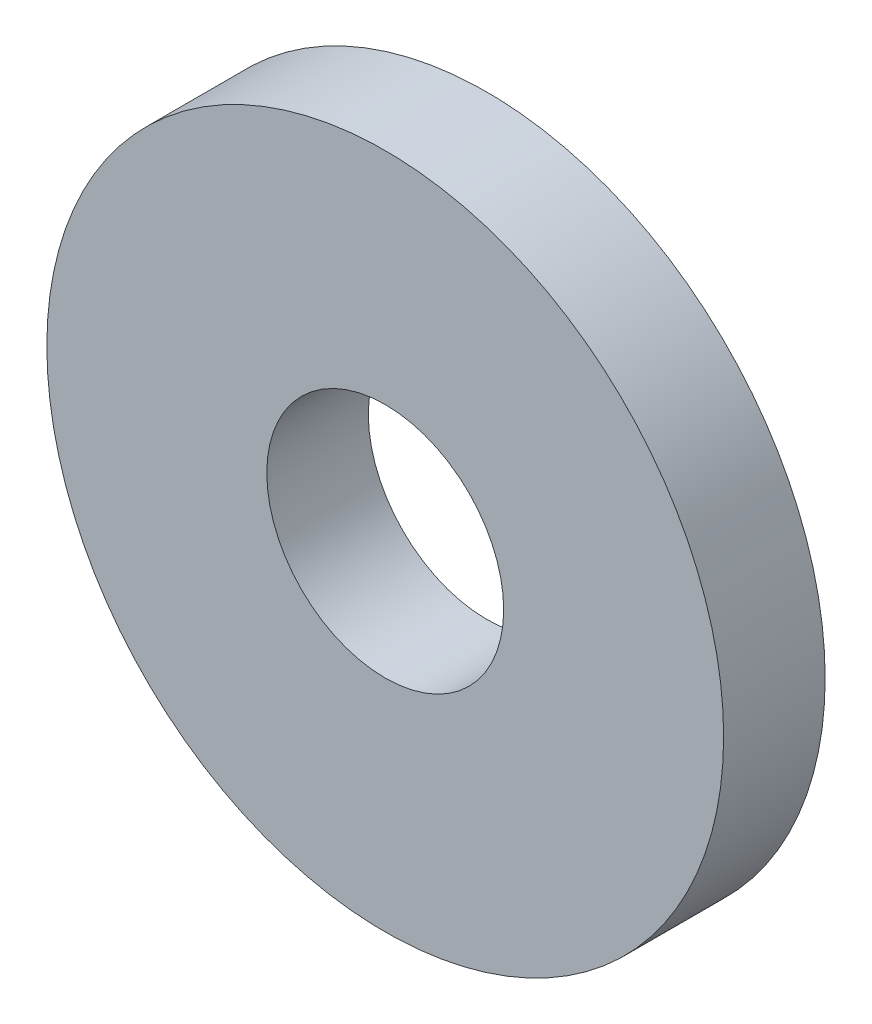
ISO-10303-21;
HEADER;
FILE_DESCRIPTION(('STEP AP214'),'2;1');
FILE_NAME('part.step','',(''),(''),'','','');
FILE_SCHEMA(('AUTOMOTIVE_DESIGN { 1 0 10303 214 1 1 1 1 }'));
ENDSEC;
DATA;
#1=APPLICATION_CONTEXT('core data for automotive mechanical design processes');
#2=APPLICATION_PROTOCOL_DEFINITION('international standard','automotive_design',2000,#1);
#3=PRODUCT_CONTEXT('',#1,'mechanical');
#4=PRODUCT('Part','Part','',(#3));
#5=PRODUCT_RELATED_PRODUCT_CATEGORY('part','',(#4));
#6=PRODUCT_DEFINITION_FORMATION('','',#4);
#7=PRODUCT_DEFINITION_CONTEXT('part definition',#1,'design');
#8=PRODUCT_DEFINITION('design','',#6,#7);
#9=PRODUCT_DEFINITION_SHAPE('','',#8);
#10=(LENGTH_UNIT() NAMED_UNIT(*) SI_UNIT(.MILLI.,.METRE.));
#11=(NAMED_UNIT(*) PLANE_ANGLE_UNIT() SI_UNIT($,.RADIAN.));
#12=(NAMED_UNIT(*) SI_UNIT($,.STERADIAN.) SOLID_ANGLE_UNIT());
#13=UNCERTAINTY_MEASURE_WITH_UNIT(LENGTH_MEASURE(1.E-05),#10,'distance_accuracy_value','');
#14=(GEOMETRIC_REPRESENTATION_CONTEXT(3) GLOBAL_UNCERTAINTY_ASSIGNED_CONTEXT((#13)) GLOBAL_UNIT_ASSIGNED_CONTEXT((#10,
#11,#12)) REPRESENTATION_CONTEXT('',''));
#15=CARTESIAN_POINT('',(0.,0.,0.));
#16=DIRECTION('',(0.,0.,1.));
#17=DIRECTION('',(1.,0.,0.));
#18=AXIS2_PLACEMENT_3D('',#15,#16,#17);
#19=CARTESIAN_POINT('',(0.,0.,3.));
#20=DIRECTION('',(0.,0.,1.));
#21=DIRECTION('',(1.,0.,0.));
#22=AXIS2_PLACEMENT_3D('',#19,#20,#21);
#23=PLANE('',#22);
#24=CARTESIAN_POINT('',(0.,0.,3.));
#25=DIRECTION('',(0.,0.,1.));
#26=DIRECTION('',(1.,0.,0.));
#27=AXIS2_PLACEMENT_3D('',#24,#25,#26);
#28=CIRCLE('',#27,10.);
#29=CARTESIAN_POINT('',(10.,0.,3.));
#30=VERTEX_POINT('',#29);
#31=EDGE_CURVE('E10',#30,#30,#28,.T.);
#32=ORIENTED_EDGE('',*,*,#31,.T.);
#33=EDGE_LOOP('',(#32));
#34=FACE_BOUND('',#33,.T.);
#35=CARTESIAN_POINT('',(0.,0.,3.));
#36=DIRECTION('',(0.,0.,1.));
#37=DIRECTION('',(1.,0.,0.));
#38=AXIS2_PLACEMENT_3D('',#35,#36,#37);
#39=CIRCLE('',#38,3.5);
#40=CARTESIAN_POINT('',(3.5,0.,3.));
#41=VERTEX_POINT('',#40);
#42=EDGE_CURVE('E44',#41,#41,#39,.T.);
#43=ORIENTED_EDGE('',*,*,#42,.F.);
#44=EDGE_LOOP('',(#43));
#45=FACE_BOUND('',#44,.T.);
#46=ADVANCED_FACE('F33',(#34,#45),#23,.T.);
#47=CARTESIAN_POINT('',(0.,0.,0.));
#48=DIRECTION('',(0.,0.,1.));
#49=DIRECTION('',(1.,0.,0.));
#50=AXIS2_PLACEMENT_3D('',#47,#48,#49);
#51=PLANE('',#50);
#52=CARTESIAN_POINT('',(0.,0.,0.));
#53=DIRECTION('',(0.,0.,1.));
#54=DIRECTION('',(1.,0.,0.));
#55=AXIS2_PLACEMENT_3D('',#52,#53,#54);
#56=CIRCLE('',#55,10.);
#57=CARTESIAN_POINT('',(10.,0.,0.));
#58=VERTEX_POINT('',#57);
#59=EDGE_CURVE('E37',#58,#58,#56,.T.);
#60=ORIENTED_EDGE('',*,*,#59,.F.);
#61=EDGE_LOOP('',(#60));
#62=FACE_BOUND('',#61,.T.);
#63=CARTESIAN_POINT('',(0.,0.,0.));
#64=DIRECTION('',(0.,0.,1.));
#65=DIRECTION('',(1.,0.,0.));
#66=AXIS2_PLACEMENT_3D('',#63,#64,#65);
#67=CIRCLE('',#66,3.5);
#68=CARTESIAN_POINT('',(3.5,0.,0.));
#69=VERTEX_POINT('',#68);
#70=EDGE_CURVE('E46',#69,#69,#67,.T.);
#71=ORIENTED_EDGE('',*,*,#70,.T.);
#72=EDGE_LOOP('',(#71));
#73=FACE_BOUND('',#72,.T.);
#74=ADVANCED_FACE('F56',(#62,#73),#51,.F.);
#75=CARTESIAN_POINT('',(0.,0.,3.));
#76=DIRECTION('',(0.,0.,-1.));
#77=DIRECTION('',(-1.,0.,0.));
#78=AXIS2_PLACEMENT_3D('',#75,#76,#77);
#79=CYLINDRICAL_SURFACE('',#78,10.);
#80=ORIENTED_EDGE('',*,*,#31,.F.);
#81=EDGE_LOOP('',(#80));
#82=FACE_BOUND('',#81,.T.);
#83=ORIENTED_EDGE('',*,*,#59,.T.);
#84=EDGE_LOOP('',(#83));
#85=FACE_BOUND('',#84,.T.);
#86=ADVANCED_FACE('F35',(#82,#85),#79,.T.);
#87=CARTESIAN_POINT('',(0.,0.,3.));
#88=DIRECTION('',(0.,0.,-1.));
#89=DIRECTION('',(-1.,0.,0.));
#90=AXIS2_PLACEMENT_3D('',#87,#88,#89);
#91=CYLINDRICAL_SURFACE('',#90,3.5);
#92=ORIENTED_EDGE('',*,*,#42,.T.);
#93=EDGE_LOOP('',(#92));
#94=FACE_BOUND('',#93,.T.);
#95=ORIENTED_EDGE('',*,*,#70,.F.);
#96=EDGE_LOOP('',(#95));
#97=FACE_BOUND('',#96,.T.);
#98=ADVANCED_FACE('F52',(#94,#97),#91,.F.);
#99=CLOSED_SHELL('',(#46,#74,#86,#98));
#100=MANIFOLD_SOLID_BREP('B2',#99);
#101=ADVANCED_BREP_SHAPE_REPRESENTATION('',(#18,#100),#14);
#102=SHAPE_DEFINITION_REPRESENTATION(#9,#101);
ENDSEC;
END-ISO-10303-21;
